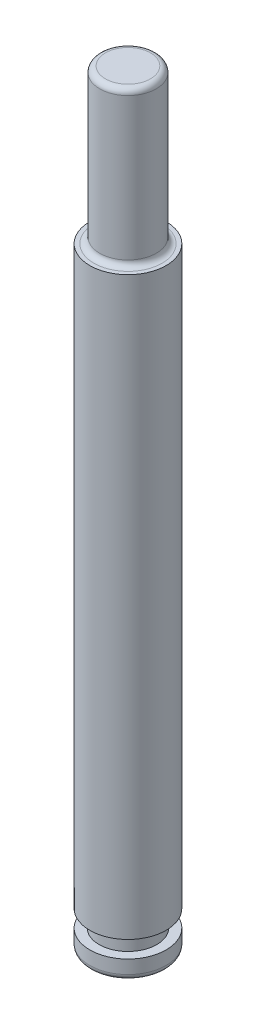
ISO-10303-21;
HEADER;
FILE_DESCRIPTION(('STEP AP214'),'2;1');
FILE_NAME('part.step','',(''),(''),'','','');
FILE_SCHEMA(('AUTOMOTIVE_DESIGN { 1 0 10303 214 1 1 1 1 }'));
ENDSEC;
DATA;
#1=APPLICATION_CONTEXT('core data for automotive mechanical design processes');
#2=APPLICATION_PROTOCOL_DEFINITION('international standard','automotive_design',2000,#1);
#3=PRODUCT_CONTEXT('',#1,'mechanical');
#4=PRODUCT('Part','Part','',(#3));
#5=PRODUCT_RELATED_PRODUCT_CATEGORY('part','',(#4));
#6=PRODUCT_DEFINITION_FORMATION('','',#4);
#7=PRODUCT_DEFINITION_CONTEXT('part definition',#1,'design');
#8=PRODUCT_DEFINITION('design','',#6,#7);
#9=PRODUCT_DEFINITION_SHAPE('','',#8);
#10=(LENGTH_UNIT() NAMED_UNIT(*) SI_UNIT(.MILLI.,.METRE.));
#11=(NAMED_UNIT(*) PLANE_ANGLE_UNIT() SI_UNIT($,.RADIAN.));
#12=(NAMED_UNIT(*) SI_UNIT($,.STERADIAN.) SOLID_ANGLE_UNIT());
#13=UNCERTAINTY_MEASURE_WITH_UNIT(LENGTH_MEASURE(1.E-05),#10,'distance_accuracy_value','');
#14=(GEOMETRIC_REPRESENTATION_CONTEXT(3) GLOBAL_UNCERTAINTY_ASSIGNED_CONTEXT((#13)) GLOBAL_UNIT_ASSIGNED_CONTEXT((#10,
#11,#12)) REPRESENTATION_CONTEXT('',''));
#15=CARTESIAN_POINT('',(0.,0.,0.));
#16=DIRECTION('',(0.,0.,1.));
#17=DIRECTION('',(1.,0.,0.));
#18=AXIS2_PLACEMENT_3D('',#15,#16,#17);
#19=CARTESIAN_POINT('',(0.,19.9,0.));
#20=DIRECTION('',(0.,1.,0.));
#21=DIRECTION('',(-1.,0.,0.));
#22=AXIS2_PLACEMENT_3D('',#19,#20,#21);
#23=PLANE('',#22);
#24=CARTESIAN_POINT('',(0.,19.9,0.));
#25=DIRECTION('',(0.,1.,0.));
#26=DIRECTION('',(-1.,0.,0.));
#27=AXIS2_PLACEMENT_3D('',#24,#25,#26);
#28=CIRCLE('',#27,0.585);
#29=CARTESIAN_POINT('',(-0.585000000000001,19.9,0.));
#30=VERTEX_POINT('',#29);
#31=EDGE_CURVE('E10',#30,#30,#28,.T.);
#32=ORIENTED_EDGE('',*,*,#31,.T.);
#33=EDGE_LOOP('',(#32));
#34=FACE_BOUND('',#33,.T.);
#35=ADVANCED_FACE('F38',(#34),#23,.T.);
#36=CARTESIAN_POINT('',(0.,19.9,0.));
#37=DIRECTION('',(0.,1.,0.));
#38=DIRECTION('',(-1.,0.,0.));
#39=AXIS2_PLACEMENT_3D('',#36,#37,#38);
#40=CYLINDRICAL_SURFACE('',#39,0.735);
#41=CARTESIAN_POINT('',(0.,16.05,0.));
#42=DIRECTION('',(0.,1.,0.));
#43=DIRECTION('',(-1.,0.,0.));
#44=AXIS2_PLACEMENT_3D('',#41,#42,#43);
#45=CIRCLE('',#44,0.735);
#46=CARTESIAN_POINT('',(-0.735000000000001,16.05,0.));
#47=VERTEX_POINT('',#46);
#48=EDGE_CURVE('E65',#47,#47,#45,.T.);
#49=ORIENTED_EDGE('',*,*,#48,.T.);
#50=EDGE_LOOP('',(#49));
#51=FACE_BOUND('',#50,.T.);
#52=CARTESIAN_POINT('',(0.,19.75,0.));
#53=DIRECTION('',(0.,1.,0.));
#54=DIRECTION('',(-1.,0.,0.));
#55=AXIS2_PLACEMENT_3D('',#52,#53,#54);
#56=CIRCLE('',#55,0.735);
#57=CARTESIAN_POINT('',(-0.735000000000001,19.75,0.));
#58=VERTEX_POINT('',#57);
#59=EDGE_CURVE('E68',#58,#58,#56,.F.);
#60=ORIENTED_EDGE('',*,*,#59,.T.);
#61=EDGE_LOOP('',(#60));
#62=FACE_BOUND('',#61,.T.);
#63=ADVANCED_FACE('F108',(#51,#62),#40,.T.);
#64=CARTESIAN_POINT('',(-0.735,15.9,0.));
#65=DIRECTION('',(0.,1.,0.));
#66=DIRECTION('',(-1.,0.,0.));
#67=AXIS2_PLACEMENT_3D('',#64,#65,#66);
#68=PLANE('',#67);
#69=CARTESIAN_POINT('',(0.,15.9,0.));
#70=DIRECTION('',(0.,1.,0.));
#71=DIRECTION('',(-1.,0.,0.));
#72=AXIS2_PLACEMENT_3D('',#69,#70,#71);
#73=CIRCLE('',#72,0.885);
#74=CARTESIAN_POINT('',(-0.885,15.9,0.));
#75=VERTEX_POINT('',#74);
#76=EDGE_CURVE('E59',#75,#75,#73,.F.);
#77=ORIENTED_EDGE('',*,*,#76,.T.);
#78=EDGE_LOOP('',(#77));
#79=FACE_BOUND('',#78,.T.);
#80=CARTESIAN_POINT('',(0.,15.9,0.));
#81=DIRECTION('',(0.,1.,0.));
#82=DIRECTION('',(-1.,0.,0.));
#83=AXIS2_PLACEMENT_3D('',#80,#81,#82);
#84=CIRCLE('',#83,0.99);
#85=CARTESIAN_POINT('',(-0.99,15.9,0.));
#86=VERTEX_POINT('',#85);
#87=EDGE_CURVE('E72',#86,#86,#84,.T.);
#88=ORIENTED_EDGE('',*,*,#87,.T.);
#89=EDGE_LOOP('',(#88));
#90=FACE_BOUND('',#89,.T.);
#91=ADVANCED_FACE('F113',(#79,#90),#68,.T.);
#92=CARTESIAN_POINT('',(0.,19.9,0.));
#93=DIRECTION('',(0.,1.,0.));
#94=DIRECTION('',(-1.,0.,0.));
#95=AXIS2_PLACEMENT_3D('',#92,#93,#94);
#96=CYLINDRICAL_SURFACE('',#95,0.989999999999999);
#97=CARTESIAN_POINT('',(0.,0.94,0.));
#98=DIRECTION('',(0.,1.,0.));
#99=DIRECTION('',(-1.,0.,0.));
#100=AXIS2_PLACEMENT_3D('',#97,#98,#99);
#101=CIRCLE('',#100,0.989999999999998);
#102=CARTESIAN_POINT('',(-0.989999999999998,0.94,0.));
#103=VERTEX_POINT('',#102);
#104=EDGE_CURVE('E76',#103,#103,#101,.T.);
#105=ORIENTED_EDGE('',*,*,#104,.T.);
#106=EDGE_LOOP('',(#105));
#107=FACE_BOUND('',#106,.T.);
#108=ORIENTED_EDGE('',*,*,#87,.F.);
#109=EDGE_LOOP('',(#108));
#110=FACE_BOUND('',#109,.T.);
#111=ADVANCED_FACE('F173',(#107,#110),#96,.T.);
#112=CARTESIAN_POINT('',(-0.989999999999998,0.94,0.));
#113=DIRECTION('',(0.,-1.,0.));
#114=DIRECTION('',(1.,0.,0.));
#115=AXIS2_PLACEMENT_3D('',#112,#113,#114);
#116=PLANE('',#115);
#117=CARTESIAN_POINT('',(0.,0.94,0.));
#118=DIRECTION('',(0.,1.,0.));
#119=DIRECTION('',(-1.,0.,0.));
#120=AXIS2_PLACEMENT_3D('',#117,#118,#119);
#121=CIRCLE('',#120,0.749999999999999);
#122=CARTESIAN_POINT('',(-0.749999999999999,0.94,0.));
#123=VERTEX_POINT('',#122);
#124=EDGE_CURVE('E79',#123,#123,#121,.T.);
#125=ORIENTED_EDGE('',*,*,#124,.T.);
#126=EDGE_LOOP('',(#125));
#127=FACE_BOUND('',#126,.T.);
#128=ORIENTED_EDGE('',*,*,#104,.F.);
#129=EDGE_LOOP('',(#128));
#130=FACE_BOUND('',#129,.T.);
#131=ADVANCED_FACE('F164',(#127,#130),#116,.T.);
#132=CARTESIAN_POINT('',(0.,19.9,0.));
#133=DIRECTION('',(0.,1.,0.));
#134=DIRECTION('',(-1.,0.,0.));
#135=AXIS2_PLACEMENT_3D('',#132,#133,#134);
#136=CYLINDRICAL_SURFACE('',#135,0.749999999999999);
#137=CARTESIAN_POINT('',(0.,0.5,0.));
#138=DIRECTION('',(0.,1.,0.));
#139=DIRECTION('',(-1.,0.,0.));
#140=AXIS2_PLACEMENT_3D('',#137,#138,#139);
#141=CIRCLE('',#140,0.749999999999999);
#142=CARTESIAN_POINT('',(-0.749999999999999,0.5,0.));
#143=VERTEX_POINT('',#142);
#144=EDGE_CURVE('E82',#143,#143,#141,.T.);
#145=ORIENTED_EDGE('',*,*,#144,.T.);
#146=EDGE_LOOP('',(#145));
#147=FACE_BOUND('',#146,.T.);
#148=ORIENTED_EDGE('',*,*,#124,.F.);
#149=EDGE_LOOP('',(#148));
#150=FACE_BOUND('',#149,.T.);
#151=ADVANCED_FACE('F105',(#147,#150),#136,.T.);
#152=CARTESIAN_POINT('',(-0.749999999999999,0.5,0.));
#153=DIRECTION('',(0.,1.,0.));
#154=DIRECTION('',(-1.,0.,0.));
#155=AXIS2_PLACEMENT_3D('',#152,#153,#154);
#156=PLANE('',#155);
#157=CARTESIAN_POINT('',(0.,0.5,0.));
#158=DIRECTION('',(0.,1.,0.));
#159=DIRECTION('',(-1.,0.,0.));
#160=AXIS2_PLACEMENT_3D('',#157,#158,#159);
#161=CIRCLE('',#160,0.989999999999999);
#162=CARTESIAN_POINT('',(-0.989999999999999,0.5,0.));
#163=VERTEX_POINT('',#162);
#164=EDGE_CURVE('E86',#163,#163,#161,.T.);
#165=ORIENTED_EDGE('',*,*,#164,.T.);
#166=EDGE_LOOP('',(#165));
#167=FACE_BOUND('',#166,.T.);
#168=ORIENTED_EDGE('',*,*,#144,.F.);
#169=EDGE_LOOP('',(#168));
#170=FACE_BOUND('',#169,.T.);
#171=ADVANCED_FACE('F91',(#167,#170),#156,.T.);
#172=CARTESIAN_POINT('',(0.,19.9,0.));
#173=DIRECTION('',(0.,1.,0.));
#174=DIRECTION('',(-1.,0.,0.));
#175=AXIS2_PLACEMENT_3D('',#172,#173,#174);
#176=CYLINDRICAL_SURFACE('',#175,0.989999999999999);
#177=CARTESIAN_POINT('',(0.,0.150000000000001,0.));
#178=DIRECTION('',(0.,-1.,0.));
#179=DIRECTION('',(1.,0.,0.));
#180=AXIS2_PLACEMENT_3D('',#177,#178,#179);
#181=CIRCLE('',#180,0.989999999999999);
#182=CARTESIAN_POINT('',(0.989999999999999,0.150000000000001,0.));
#183=VERTEX_POINT('',#182);
#184=EDGE_CURVE('E53',#183,#183,#181,.F.);
#185=ORIENTED_EDGE('',*,*,#184,.T.);
#186=EDGE_LOOP('',(#185));
#187=FACE_BOUND('',#186,.T.);
#188=ORIENTED_EDGE('',*,*,#164,.F.);
#189=EDGE_LOOP('',(#188));
#190=FACE_BOUND('',#189,.T.);
#191=ADVANCED_FACE('F94',(#187,#190),#176,.T.);
#192=CARTESIAN_POINT('',(-0.989999999999998,0.,0.));
#193=DIRECTION('',(0.,-1.,0.));
#194=DIRECTION('',(1.,0.,0.));
#195=AXIS2_PLACEMENT_3D('',#192,#193,#194);
#196=PLANE('',#195);
#197=CARTESIAN_POINT('',(0.,0.,0.));
#198=DIRECTION('',(0.,-1.,0.));
#199=DIRECTION('',(1.,0.,0.));
#200=AXIS2_PLACEMENT_3D('',#197,#198,#199);
#201=CIRCLE('',#200,0.839999999999999);
#202=CARTESIAN_POINT('',(0.839999999999999,0.,0.));
#203=VERTEX_POINT('',#202);
#204=EDGE_CURVE('E46',#203,#203,#201,.T.);
#205=ORIENTED_EDGE('',*,*,#204,.T.);
#206=EDGE_LOOP('',(#205));
#207=FACE_BOUND('',#206,.T.);
#208=ADVANCED_FACE('F96',(#207),#196,.T.);
#209=CARTESIAN_POINT('',(0.,16.05,0.));
#210=DIRECTION('',(0.,1.,0.));
#211=DIRECTION('',(-1.,0.,0.));
#212=AXIS2_PLACEMENT_3D('',#209,#210,#211);
#213=TOROIDAL_SURFACE('',#212,0.885,0.15);
#214=ORIENTED_EDGE('',*,*,#76,.F.);
#215=EDGE_LOOP('',(#214));
#216=FACE_BOUND('',#215,.T.);
#217=ORIENTED_EDGE('',*,*,#48,.F.);
#218=EDGE_LOOP('',(#217));
#219=FACE_BOUND('',#218,.T.);
#220=ADVANCED_FACE('F103',(#216,#219),#213,.F.);
#221=CARTESIAN_POINT('',(0.,0.150000000000001,0.));
#222=DIRECTION('',(0.,-1.,0.));
#223=DIRECTION('',(1.,0.,0.));
#224=AXIS2_PLACEMENT_3D('',#221,#222,#223);
#225=TOROIDAL_SURFACE('',#224,0.839999999999999,0.15);
#226=ORIENTED_EDGE('',*,*,#204,.F.);
#227=EDGE_LOOP('',(#226));
#228=FACE_BOUND('',#227,.T.);
#229=ORIENTED_EDGE('',*,*,#184,.F.);
#230=EDGE_LOOP('',(#229));
#231=FACE_BOUND('',#230,.T.);
#232=ADVANCED_FACE('F119',(#228,#231),#225,.T.);
#233=CARTESIAN_POINT('',(0.,19.75,0.));
#234=DIRECTION('',(0.,1.,0.));
#235=DIRECTION('',(-1.,0.,0.));
#236=AXIS2_PLACEMENT_3D('',#233,#234,#235);
#237=TOROIDAL_SURFACE('',#236,0.585,0.15);
#238=ORIENTED_EDGE('',*,*,#59,.F.);
#239=EDGE_LOOP('',(#238));
#240=FACE_BOUND('',#239,.T.);
#241=ORIENTED_EDGE('',*,*,#31,.F.);
#242=EDGE_LOOP('',(#241));
#243=FACE_BOUND('',#242,.T.);
#244=ADVANCED_FACE('F40',(#240,#243),#237,.T.);
#245=CLOSED_SHELL('',(#35,#63,#91,#111,#131,#151,#171,#191,#208,#220,#232,#244));
#246=MANIFOLD_SOLID_BREP('B2',#245);
#247=ADVANCED_BREP_SHAPE_REPRESENTATION('',(#18,#246),#14);
#248=SHAPE_DEFINITION_REPRESENTATION(#9,#247);
ENDSEC;
END-ISO-10303-21;
